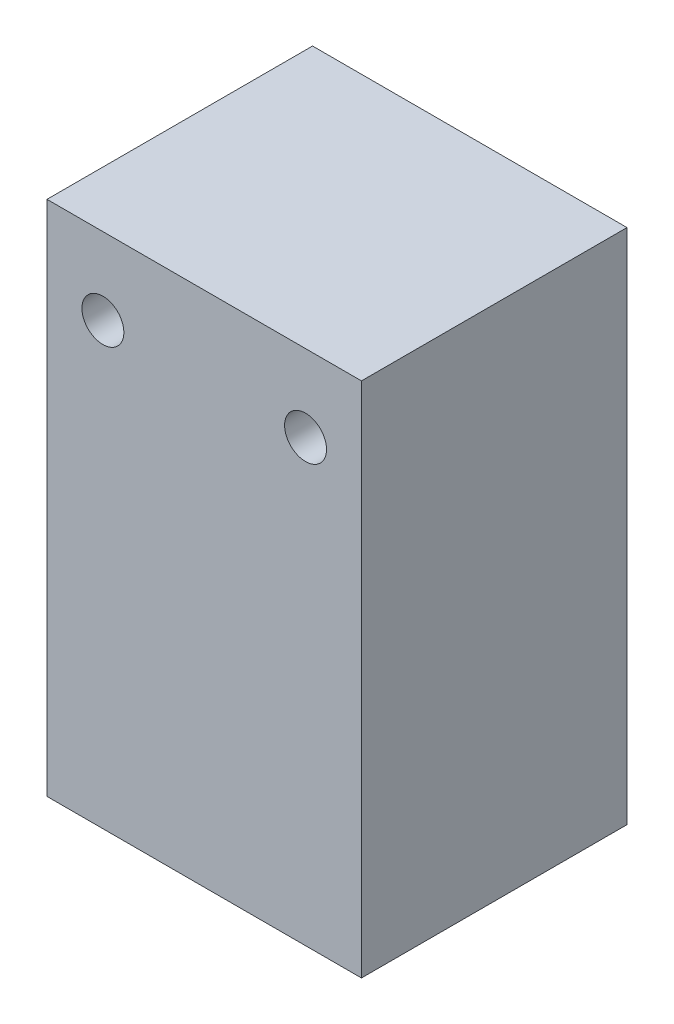
ISO-10303-21;
HEADER;
FILE_DESCRIPTION(('STEP AP214'),'2;1');
FILE_NAME('part.step','',(''),(''),'','','');
FILE_SCHEMA(('AUTOMOTIVE_DESIGN { 1 0 10303 214 1 1 1 1 }'));
ENDSEC;
DATA;
#1=APPLICATION_CONTEXT('core data for automotive mechanical design processes');
#2=APPLICATION_PROTOCOL_DEFINITION('international standard','automotive_design',2000,#1);
#3=PRODUCT_CONTEXT('',#1,'mechanical');
#4=PRODUCT('Part','Part','',(#3));
#5=PRODUCT_RELATED_PRODUCT_CATEGORY('part','',(#4));
#6=PRODUCT_DEFINITION_FORMATION('','',#4);
#7=PRODUCT_DEFINITION_CONTEXT('part definition',#1,'design');
#8=PRODUCT_DEFINITION('design','',#6,#7);
#9=PRODUCT_DEFINITION_SHAPE('','',#8);
#10=(LENGTH_UNIT() NAMED_UNIT(*) SI_UNIT(.MILLI.,.METRE.));
#11=(NAMED_UNIT(*) PLANE_ANGLE_UNIT() SI_UNIT($,.RADIAN.));
#12=(NAMED_UNIT(*) SI_UNIT($,.STERADIAN.) SOLID_ANGLE_UNIT());
#13=UNCERTAINTY_MEASURE_WITH_UNIT(LENGTH_MEASURE(1.E-05),#10,'distance_accuracy_value','');
#14=(GEOMETRIC_REPRESENTATION_CONTEXT(3) GLOBAL_UNCERTAINTY_ASSIGNED_CONTEXT((#13)) GLOBAL_UNIT_ASSIGNED_CONTEXT((#10,
#11,#12)) REPRESENTATION_CONTEXT('',''));
#15=CARTESIAN_POINT('',(0.,0.,0.));
#16=DIRECTION('',(0.,0.,1.));
#17=DIRECTION('',(1.,0.,0.));
#18=AXIS2_PLACEMENT_3D('',#15,#16,#17);
#19=CARTESIAN_POINT('',(0.,0.,19.));
#20=DIRECTION('',(0.,-1.,0.));
#21=DIRECTION('',(1.,0.,0.));
#22=AXIS2_PLACEMENT_3D('',#19,#20,#21);
#23=PLANE('',#22);
#24=DIRECTION('',(-1.,0.,0.));
#25=VECTOR('',#24,1.);
#26=CARTESIAN_POINT('',(0.,0.,0.));
#27=LINE('',#26,#25);
#28=CARTESIAN_POINT('',(0.,0.,0.));
#29=VERTEX_POINT('',#28);
#30=CARTESIAN_POINT('',(-22.5,0.,0.));
#31=VERTEX_POINT('',#30);
#32=EDGE_CURVE('E204',#29,#31,#27,.T.);
#33=ORIENTED_EDGE('',*,*,#32,.F.);
#34=DIRECTION('',(0.,0.,-1.));
#35=VECTOR('',#34,1.);
#36=CARTESIAN_POINT('',(0.,0.,19.));
#37=LINE('',#36,#35);
#38=CARTESIAN_POINT('',(0.,0.,19.));
#39=VERTEX_POINT('',#38);
#40=EDGE_CURVE('E44',#39,#29,#37,.T.);
#41=ORIENTED_EDGE('',*,*,#40,.F.);
#42=DIRECTION('',(-1.,0.,0.));
#43=VECTOR('',#42,1.);
#44=CARTESIAN_POINT('',(0.,0.,19.));
#45=LINE('',#44,#43);
#46=CARTESIAN_POINT('',(-22.5,0.,19.));
#47=VERTEX_POINT('',#46);
#48=EDGE_CURVE('E187',#39,#47,#45,.T.);
#49=ORIENTED_EDGE('',*,*,#48,.T.);
#50=DIRECTION('',(0.,0.,-1.));
#51=VECTOR('',#50,1.);
#52=CARTESIAN_POINT('',(-22.5,0.,19.));
#53=LINE('',#52,#51);
#54=EDGE_CURVE('E11',#47,#31,#53,.T.);
#55=ORIENTED_EDGE('',*,*,#54,.T.);
#56=EDGE_LOOP('',(#33,#41,#49,#55));
#57=FACE_BOUND('',#56,.T.);
#58=DIRECTION('',(1.,0.,0.));
#59=VECTOR('',#58,1.);
#60=CARTESIAN_POINT('',(-13.825,0.,8.15));
#61=LINE('',#60,#59);
#62=CARTESIAN_POINT('',(-13.825,0.,8.15));
#63=VERTEX_POINT('',#62);
#64=CARTESIAN_POINT('',(-8.675,0.,8.15));
#65=VERTEX_POINT('',#64);
#66=EDGE_CURVE('E437',#63,#65,#61,.T.);
#67=ORIENTED_EDGE('',*,*,#66,.F.);
#68=DIRECTION('',(0.,0.,-1.));
#69=VECTOR('',#68,1.);
#70=CARTESIAN_POINT('',(-13.825,0.,10.85));
#71=LINE('',#70,#69);
#72=CARTESIAN_POINT('',(-13.825,0.,10.85));
#73=VERTEX_POINT('',#72);
#74=EDGE_CURVE('E147',#73,#63,#71,.T.);
#75=ORIENTED_EDGE('',*,*,#74,.F.);
#76=DIRECTION('',(-1.,0.,0.));
#77=VECTOR('',#76,1.);
#78=CARTESIAN_POINT('',(-13.825,0.,10.85));
#79=LINE('',#78,#77);
#80=CARTESIAN_POINT('',(-8.675,0.,10.85));
#81=VERTEX_POINT('',#80);
#82=EDGE_CURVE('E143',#81,#73,#79,.T.);
#83=ORIENTED_EDGE('',*,*,#82,.F.);
#84=DIRECTION('',(0.,0.,1.));
#85=VECTOR('',#84,1.);
#86=CARTESIAN_POINT('',(-8.675,0.,10.85));
#87=LINE('',#86,#85);
#88=EDGE_CURVE('E444',#65,#81,#87,.T.);
#89=ORIENTED_EDGE('',*,*,#88,.F.);
#90=EDGE_LOOP('',(#67,#75,#83,#89));
#91=FACE_BOUND('',#90,.T.);
#92=ADVANCED_FACE('F35',(#57,#91),#23,.T.);
#93=CARTESIAN_POINT('',(0.,0.,0.));
#94=DIRECTION('',(0.,0.,1.));
#95=DIRECTION('',(1.,0.,0.));
#96=AXIS2_PLACEMENT_3D('',#93,#94,#95);
#97=PLANE('',#96);
#98=CARTESIAN_POINT('',(-4.,31.5,0.));
#99=DIRECTION('',(0.,0.,1.));
#100=DIRECTION('',(1.,0.,0.));
#101=AXIS2_PLACEMENT_3D('',#98,#99,#100);
#102=CIRCLE('',#101,1.5);
#103=CARTESIAN_POINT('',(-2.5,31.5,0.));
#104=VERTEX_POINT('',#103);
#105=EDGE_CURVE('E188',#104,#104,#102,.T.);
#106=ORIENTED_EDGE('',*,*,#105,.T.);
#107=EDGE_LOOP('',(#106));
#108=FACE_BOUND('',#107,.T.);
#109=CARTESIAN_POINT('',(-18.5,31.5,0.));
#110=DIRECTION('',(0.,0.,1.));
#111=DIRECTION('',(1.,0.,0.));
#112=AXIS2_PLACEMENT_3D('',#109,#110,#111);
#113=CIRCLE('',#112,1.5);
#114=CARTESIAN_POINT('',(-17.,31.5,0.));
#115=VERTEX_POINT('',#114);
#116=EDGE_CURVE('E212',#115,#115,#113,.T.);
#117=ORIENTED_EDGE('',*,*,#116,.T.);
#118=EDGE_LOOP('',(#117));
#119=FACE_BOUND('',#118,.T.);
#120=DIRECTION('',(0.,1.,0.));
#121=VECTOR('',#120,1.);
#122=CARTESIAN_POINT('',(-22.5,0.,0.));
#123=LINE('',#122,#121);
#124=CARTESIAN_POINT('',(-22.5,37.,0.));
#125=VERTEX_POINT('',#124);
#126=EDGE_CURVE('E175',#31,#125,#123,.T.);
#127=ORIENTED_EDGE('',*,*,#126,.T.);
#128=DIRECTION('',(-1.,0.,0.));
#129=VECTOR('',#128,1.);
#130=CARTESIAN_POINT('',(0.,37.,0.));
#131=LINE('',#130,#129);
#132=CARTESIAN_POINT('',(0.,37.,0.));
#133=VERTEX_POINT('',#132);
#134=EDGE_CURVE('E209',#133,#125,#131,.T.);
#135=ORIENTED_EDGE('',*,*,#134,.F.);
#136=DIRECTION('',(0.,1.,0.));
#137=VECTOR('',#136,1.);
#138=CARTESIAN_POINT('',(0.,0.,0.));
#139=LINE('',#138,#137);
#140=EDGE_CURVE('E207',#29,#133,#139,.T.);
#141=ORIENTED_EDGE('',*,*,#140,.F.);
#142=ORIENTED_EDGE('',*,*,#32,.T.);
#143=EDGE_LOOP('',(#127,#135,#141,#142));
#144=FACE_BOUND('',#143,.T.);
#145=CARTESIAN_POINT('',(-11.1,10.55,0.));
#146=DIRECTION('',(0.,0.,1.));
#147=DIRECTION('',(1.,0.,0.));
#148=AXIS2_PLACEMENT_3D('',#145,#146,#147);
#149=CIRCLE('',#148,2.5);
#150=CARTESIAN_POINT('',(-9.41848282791998,12.4,0.));
#151=VERTEX_POINT('',#150);
#152=CARTESIAN_POINT('',(-9.41848282791998,8.7,0.));
#153=VERTEX_POINT('',#152);
#154=EDGE_CURVE('E149',#151,#153,#149,.F.);
#155=ORIENTED_EDGE('',*,*,#154,.F.);
#156=DIRECTION('',(1.,0.,0.));
#157=VECTOR('',#156,1.);
#158=CARTESIAN_POINT('',(0.,12.4,0.));
#159=LINE('',#158,#157);
#160=CARTESIAN_POINT('',(-13.08151717208,12.4,0.));
#161=VERTEX_POINT('',#160);
#162=EDGE_CURVE('E152',#161,#151,#159,.T.);
#163=ORIENTED_EDGE('',*,*,#162,.F.);
#164=CARTESIAN_POINT('',(-11.4,10.55,0.));
#165=DIRECTION('',(0.,0.,1.));
#166=DIRECTION('',(1.,0.,0.));
#167=AXIS2_PLACEMENT_3D('',#164,#165,#166);
#168=CIRCLE('',#167,2.5);
#169=CARTESIAN_POINT('',(-13.08151717208,8.7,0.));
#170=VERTEX_POINT('',#169);
#171=EDGE_CURVE('E169',#170,#161,#168,.F.);
#172=ORIENTED_EDGE('',*,*,#171,.F.);
#173=DIRECTION('',(1.,0.,0.));
#174=VECTOR('',#173,1.);
#175=CARTESIAN_POINT('',(0.,8.7,0.));
#176=LINE('',#175,#174);
#177=EDGE_CURVE('E59',#170,#153,#176,.T.);
#178=ORIENTED_EDGE('',*,*,#177,.T.);
#179=EDGE_LOOP('',(#155,#163,#172,#178));
#180=FACE_BOUND('',#179,.T.);
#181=ADVANCED_FACE('F231',(#108,#119,#144,#180),#97,.F.);
#182=CARTESIAN_POINT('',(-22.5,0.,19.));
#183=DIRECTION('',(-1.,0.,0.));
#184=DIRECTION('',(0.,0.,1.));
#185=AXIS2_PLACEMENT_3D('',#182,#183,#184);
#186=PLANE('',#185);
#187=ORIENTED_EDGE('',*,*,#126,.F.);
#188=ORIENTED_EDGE('',*,*,#54,.F.);
#189=DIRECTION('',(0.,1.,0.));
#190=VECTOR('',#189,1.);
#191=CARTESIAN_POINT('',(-22.5,0.,19.));
#192=LINE('',#191,#190);
#193=CARTESIAN_POINT('',(-22.5,37.,19.));
#194=VERTEX_POINT('',#193);
#195=EDGE_CURVE('E184',#47,#194,#192,.T.);
#196=ORIENTED_EDGE('',*,*,#195,.T.);
#197=DIRECTION('',(0.,0.,-1.));
#198=VECTOR('',#197,1.);
#199=CARTESIAN_POINT('',(-22.5,37.,19.));
#200=LINE('',#199,#198);
#201=EDGE_CURVE('E201',#194,#125,#200,.T.);
#202=ORIENTED_EDGE('',*,*,#201,.T.);
#203=EDGE_LOOP('',(#187,#188,#196,#202));
#204=FACE_BOUND('',#203,.T.);
#205=ADVANCED_FACE('F37',(#204),#186,.T.);
#206=CARTESIAN_POINT('',(0.,0.,19.));
#207=DIRECTION('',(-1.,0.,0.));
#208=DIRECTION('',(0.,0.,1.));
#209=AXIS2_PLACEMENT_3D('',#206,#207,#208);
#210=PLANE('',#209);
#211=ORIENTED_EDGE('',*,*,#140,.T.);
#212=DIRECTION('',(0.,0.,-1.));
#213=VECTOR('',#212,1.);
#214=CARTESIAN_POINT('',(0.,37.,19.));
#215=LINE('',#214,#213);
#216=CARTESIAN_POINT('',(0.,37.,19.));
#217=VERTEX_POINT('',#216);
#218=EDGE_CURVE('E218',#217,#133,#215,.T.);
#219=ORIENTED_EDGE('',*,*,#218,.F.);
#220=DIRECTION('',(0.,1.,0.));
#221=VECTOR('',#220,1.);
#222=CARTESIAN_POINT('',(0.,0.,19.));
#223=LINE('',#222,#221);
#224=EDGE_CURVE('E191',#39,#217,#223,.T.);
#225=ORIENTED_EDGE('',*,*,#224,.F.);
#226=ORIENTED_EDGE('',*,*,#40,.T.);
#227=EDGE_LOOP('',(#211,#219,#225,#226));
#228=FACE_BOUND('',#227,.T.);
#229=ADVANCED_FACE('F224',(#228),#210,.F.);
#230=CARTESIAN_POINT('',(-18.5,31.5,19.));
#231=DIRECTION('',(0.,0.,-1.));
#232=DIRECTION('',(-1.,0.,0.));
#233=AXIS2_PLACEMENT_3D('',#230,#231,#232);
#234=CYLINDRICAL_SURFACE('',#233,1.5);
#235=CARTESIAN_POINT('',(-18.5,31.5,19.));
#236=DIRECTION('',(0.,0.,1.));
#237=DIRECTION('',(1.,0.,0.));
#238=AXIS2_PLACEMENT_3D('',#235,#236,#237);
#239=CIRCLE('',#238,1.5);
#240=CARTESIAN_POINT('',(-17.,31.5,19.));
#241=VERTEX_POINT('',#240);
#242=EDGE_CURVE('E195',#241,#241,#239,.T.);
#243=ORIENTED_EDGE('',*,*,#242,.T.);
#244=EDGE_LOOP('',(#243));
#245=FACE_BOUND('',#244,.T.);
#246=ORIENTED_EDGE('',*,*,#116,.F.);
#247=EDGE_LOOP('',(#246));
#248=FACE_BOUND('',#247,.T.);
#249=ADVANCED_FACE('F261',(#245,#248),#234,.F.);
#250=CARTESIAN_POINT('',(0.,37.,19.));
#251=DIRECTION('',(0.,-1.,0.));
#252=DIRECTION('',(0.,0.,-1.));
#253=AXIS2_PLACEMENT_3D('',#250,#251,#252);
#254=PLANE('',#253);
#255=ORIENTED_EDGE('',*,*,#134,.T.);
#256=ORIENTED_EDGE('',*,*,#201,.F.);
#257=DIRECTION('',(-1.,0.,0.));
#258=VECTOR('',#257,1.);
#259=CARTESIAN_POINT('',(0.,37.,19.));
#260=LINE('',#259,#258);
#261=EDGE_CURVE('E193',#217,#194,#260,.T.);
#262=ORIENTED_EDGE('',*,*,#261,.F.);
#263=ORIENTED_EDGE('',*,*,#218,.T.);
#264=EDGE_LOOP('',(#255,#256,#262,#263));
#265=FACE_BOUND('',#264,.T.);
#266=ADVANCED_FACE('F239',(#265),#254,.F.);
#267=CARTESIAN_POINT('',(-4.,31.5,19.));
#268=DIRECTION('',(0.,0.,-1.));
#269=DIRECTION('',(-1.,0.,0.));
#270=AXIS2_PLACEMENT_3D('',#267,#268,#269);
#271=CYLINDRICAL_SURFACE('',#270,1.5);
#272=CARTESIAN_POINT('',(-4.,31.5,19.));
#273=DIRECTION('',(0.,0.,1.));
#274=DIRECTION('',(1.,0.,0.));
#275=AXIS2_PLACEMENT_3D('',#272,#273,#274);
#276=CIRCLE('',#275,1.5);
#277=CARTESIAN_POINT('',(-2.5,31.5,19.));
#278=VERTEX_POINT('',#277);
#279=EDGE_CURVE('E198',#278,#278,#276,.T.);
#280=ORIENTED_EDGE('',*,*,#279,.T.);
#281=EDGE_LOOP('',(#280));
#282=FACE_BOUND('',#281,.T.);
#283=ORIENTED_EDGE('',*,*,#105,.F.);
#284=EDGE_LOOP('',(#283));
#285=FACE_BOUND('',#284,.T.);
#286=ADVANCED_FACE('F245',(#282,#285),#271,.F.);
#287=CARTESIAN_POINT('',(0.,0.,19.));
#288=DIRECTION('',(0.,0.,1.));
#289=DIRECTION('',(1.,0.,0.));
#290=AXIS2_PLACEMENT_3D('',#287,#288,#289);
#291=PLANE('',#290);
#292=ORIENTED_EDGE('',*,*,#195,.F.);
#293=ORIENTED_EDGE('',*,*,#48,.F.);
#294=ORIENTED_EDGE('',*,*,#224,.T.);
#295=ORIENTED_EDGE('',*,*,#261,.T.);
#296=EDGE_LOOP('',(#292,#293,#294,#295));
#297=FACE_BOUND('',#296,.T.);
#298=ORIENTED_EDGE('',*,*,#242,.F.);
#299=EDGE_LOOP('',(#298));
#300=FACE_BOUND('',#299,.T.);
#301=ORIENTED_EDGE('',*,*,#279,.F.);
#302=EDGE_LOOP('',(#301));
#303=FACE_BOUND('',#302,.T.);
#304=ADVANCED_FACE('F241',(#297,#300,#303),#291,.T.);
#305=CARTESIAN_POINT('',(-11.1,10.55,-8.));
#306=DIRECTION('',(0.,0.,1.));
#307=DIRECTION('',(1.,0.,0.));
#308=AXIS2_PLACEMENT_3D('',#305,#306,#307);
#309=CYLINDRICAL_SURFACE('',#308,2.5);
#310=ORIENTED_EDGE('',*,*,#154,.T.);
#311=DIRECTION('',(0.,0.,1.));
#312=VECTOR('',#311,1.);
#313=CARTESIAN_POINT('',(-9.41848282791998,8.7,-8.));
#314=LINE('',#313,#312);
#315=CARTESIAN_POINT('',(-9.41848282791998,8.7,-8.));
#316=VERTEX_POINT('',#315);
#317=EDGE_CURVE('E173',#316,#153,#314,.T.);
#318=ORIENTED_EDGE('',*,*,#317,.F.);
#319=CARTESIAN_POINT('',(-11.1,10.55,-8.));
#320=DIRECTION('',(0.,0.,1.));
#321=DIRECTION('',(1.,0.,0.));
#322=AXIS2_PLACEMENT_3D('',#319,#320,#321);
#323=CIRCLE('',#322,2.5);
#324=CARTESIAN_POINT('',(-9.41848282791998,12.4,-8.));
#325=VERTEX_POINT('',#324);
#326=EDGE_CURVE('E157',#325,#316,#323,.F.);
#327=ORIENTED_EDGE('',*,*,#326,.F.);
#328=DIRECTION('',(0.,0.,1.));
#329=VECTOR('',#328,1.);
#330=CARTESIAN_POINT('',(-9.41848282791998,12.4,-8.));
#331=LINE('',#330,#329);
#332=EDGE_CURVE('E165',#325,#151,#331,.T.);
#333=ORIENTED_EDGE('',*,*,#332,.T.);
#334=EDGE_LOOP('',(#310,#318,#327,#333));
#335=FACE_BOUND('',#334,.T.);
#336=ADVANCED_FACE('F244',(#335),#309,.T.);
#337=CARTESIAN_POINT('',(0.,8.7,-8.));
#338=DIRECTION('',(0.,-1.,0.));
#339=DIRECTION('',(0.,0.,-1.));
#340=AXIS2_PLACEMENT_3D('',#337,#338,#339);
#341=PLANE('',#340);
#342=ORIENTED_EDGE('',*,*,#177,.F.);
#343=DIRECTION('',(0.,0.,1.));
#344=VECTOR('',#343,1.);
#345=CARTESIAN_POINT('',(-13.08151717208,8.7,-8.));
#346=LINE('',#345,#344);
#347=CARTESIAN_POINT('',(-13.08151717208,8.7,-8.));
#348=VERTEX_POINT('',#347);
#349=EDGE_CURVE('E176',#348,#170,#346,.T.);
#350=ORIENTED_EDGE('',*,*,#349,.F.);
#351=DIRECTION('',(1.,0.,0.));
#352=VECTOR('',#351,1.);
#353=CARTESIAN_POINT('',(0.,8.7,-8.));
#354=LINE('',#353,#352);
#355=EDGE_CURVE('E163',#348,#316,#354,.T.);
#356=ORIENTED_EDGE('',*,*,#355,.T.);
#357=ORIENTED_EDGE('',*,*,#317,.T.);
#358=EDGE_LOOP('',(#342,#350,#356,#357));
#359=FACE_BOUND('',#358,.T.);
#360=ADVANCED_FACE('F344',(#359),#341,.T.);
#361=CARTESIAN_POINT('',(-11.4,10.55,-8.));
#362=DIRECTION('',(0.,0.,1.));
#363=DIRECTION('',(1.,0.,0.));
#364=AXIS2_PLACEMENT_3D('',#361,#362,#363);
#365=CYLINDRICAL_SURFACE('',#364,2.5);
#366=ORIENTED_EDGE('',*,*,#171,.T.);
#367=DIRECTION('',(0.,0.,1.));
#368=VECTOR('',#367,1.);
#369=CARTESIAN_POINT('',(-13.08151717208,12.4,-8.));
#370=LINE('',#369,#368);
#371=CARTESIAN_POINT('',(-13.08151717208,12.4,-8.));
#372=VERTEX_POINT('',#371);
#373=EDGE_CURVE('E179',#372,#161,#370,.T.);
#374=ORIENTED_EDGE('',*,*,#373,.F.);
#375=CARTESIAN_POINT('',(-11.4,10.55,-8.));
#376=DIRECTION('',(0.,0.,1.));
#377=DIRECTION('',(1.,0.,0.));
#378=AXIS2_PLACEMENT_3D('',#375,#376,#377);
#379=CIRCLE('',#378,2.5);
#380=EDGE_CURVE('E161',#348,#372,#379,.F.);
#381=ORIENTED_EDGE('',*,*,#380,.F.);
#382=ORIENTED_EDGE('',*,*,#349,.T.);
#383=EDGE_LOOP('',(#366,#374,#381,#382));
#384=FACE_BOUND('',#383,.T.);
#385=ADVANCED_FACE('F347',(#384),#365,.T.);
#386=CARTESIAN_POINT('',(0.,12.4,-8.));
#387=DIRECTION('',(0.,-1.,0.));
#388=DIRECTION('',(0.,0.,-1.));
#389=AXIS2_PLACEMENT_3D('',#386,#387,#388);
#390=PLANE('',#389);
#391=ORIENTED_EDGE('',*,*,#162,.T.);
#392=ORIENTED_EDGE('',*,*,#332,.F.);
#393=DIRECTION('',(1.,0.,0.));
#394=VECTOR('',#393,1.);
#395=CARTESIAN_POINT('',(0.,12.4,-8.));
#396=LINE('',#395,#394);
#397=EDGE_CURVE('E159',#372,#325,#396,.T.);
#398=ORIENTED_EDGE('',*,*,#397,.F.);
#399=ORIENTED_EDGE('',*,*,#373,.T.);
#400=EDGE_LOOP('',(#391,#392,#398,#399));
#401=FACE_BOUND('',#400,.T.);
#402=ADVANCED_FACE('F342',(#401),#390,.F.);
#403=CARTESIAN_POINT('',(0.,0.,-8.));
#404=DIRECTION('',(0.,0.,1.));
#405=DIRECTION('',(1.,0.,0.));
#406=AXIS2_PLACEMENT_3D('',#403,#404,#405);
#407=PLANE('',#406);
#408=ORIENTED_EDGE('',*,*,#326,.T.);
#409=ORIENTED_EDGE('',*,*,#355,.F.);
#410=ORIENTED_EDGE('',*,*,#380,.T.);
#411=ORIENTED_EDGE('',*,*,#397,.T.);
#412=EDGE_LOOP('',(#408,#409,#410,#411));
#413=FACE_BOUND('',#412,.T.);
#414=ADVANCED_FACE('F281',(#413),#407,.F.);
#415=CARTESIAN_POINT('',(-13.825,-4.8,10.85));
#416=DIRECTION('',(1.,0.,0.));
#417=DIRECTION('',(0.,1.,0.));
#418=AXIS2_PLACEMENT_3D('',#415,#416,#417);
#419=PLANE('',#418);
#420=ORIENTED_EDGE('',*,*,#74,.T.);
#421=DIRECTION('',(0.,1.,0.));
#422=VECTOR('',#421,1.);
#423=CARTESIAN_POINT('',(-13.825,-4.8,8.15));
#424=LINE('',#423,#422);
#425=CARTESIAN_POINT('',(-13.825,-4.8,8.15));
#426=VERTEX_POINT('',#425);
#427=EDGE_CURVE('E128',#426,#63,#424,.T.);
#428=ORIENTED_EDGE('',*,*,#427,.F.);
#429=DIRECTION('',(0.,0.,-1.));
#430=VECTOR('',#429,1.);
#431=CARTESIAN_POINT('',(-13.825,-4.8,10.85));
#432=LINE('',#431,#430);
#433=CARTESIAN_POINT('',(-13.825,-4.8,10.85));
#434=VERTEX_POINT('',#433);
#435=EDGE_CURVE('E135',#434,#426,#432,.T.);
#436=ORIENTED_EDGE('',*,*,#435,.F.);
#437=DIRECTION('',(0.,1.,0.));
#438=VECTOR('',#437,1.);
#439=CARTESIAN_POINT('',(-13.825,-4.8,10.85));
#440=LINE('',#439,#438);
#441=EDGE_CURVE('E441',#434,#73,#440,.T.);
#442=ORIENTED_EDGE('',*,*,#441,.T.);
#443=EDGE_LOOP('',(#420,#428,#436,#442));
#444=FACE_BOUND('',#443,.T.);
#445=ADVANCED_FACE('F145',(#444),#419,.F.);
#446=CARTESIAN_POINT('',(-13.825,-4.8,8.15));
#447=DIRECTION('',(0.,0.,1.));
#448=DIRECTION('',(1.,0.,0.));
#449=AXIS2_PLACEMENT_3D('',#446,#447,#448);
#450=PLANE('',#449);
#451=CARTESIAN_POINT('',(-11.25,-2.4,8.15));
#452=DIRECTION('',(0.,0.,1.));
#453=DIRECTION('',(1.,0.,0.));
#454=AXIS2_PLACEMENT_3D('',#451,#452,#453);
#455=CIRCLE('',#454,1.5);
#456=CARTESIAN_POINT('',(-9.75,-2.4,8.15));
#457=VERTEX_POINT('',#456);
#458=EDGE_CURVE('E435',#457,#457,#455,.T.);
#459=ORIENTED_EDGE('',*,*,#458,.T.);
#460=EDGE_LOOP('',(#459));
#461=FACE_BOUND('',#460,.T.);
#462=ORIENTED_EDGE('',*,*,#66,.T.);
#463=DIRECTION('',(0.,1.,0.));
#464=VECTOR('',#463,1.);
#465=CARTESIAN_POINT('',(-8.675,-4.8,8.15));
#466=LINE('',#465,#464);
#467=CARTESIAN_POINT('',(-8.675,-4.8,8.15));
#468=VERTEX_POINT('',#467);
#469=EDGE_CURVE('E131',#468,#65,#466,.T.);
#470=ORIENTED_EDGE('',*,*,#469,.F.);
#471=DIRECTION('',(1.,0.,0.));
#472=VECTOR('',#471,1.);
#473=CARTESIAN_POINT('',(-13.825,-4.8,8.15));
#474=LINE('',#473,#472);
#475=EDGE_CURVE('E124',#426,#468,#474,.T.);
#476=ORIENTED_EDGE('',*,*,#475,.F.);
#477=ORIENTED_EDGE('',*,*,#427,.T.);
#478=EDGE_LOOP('',(#462,#470,#476,#477));
#479=FACE_BOUND('',#478,.T.);
#480=ADVANCED_FACE('F126',(#461,#479),#450,.F.);
#481=CARTESIAN_POINT('',(-8.675,-4.8,10.85));
#482=DIRECTION('',(-1.,0.,0.));
#483=DIRECTION('',(0.,-1.,0.));
#484=AXIS2_PLACEMENT_3D('',#481,#482,#483);
#485=PLANE('',#484);
#486=ORIENTED_EDGE('',*,*,#88,.T.);
#487=DIRECTION('',(0.,1.,0.));
#488=VECTOR('',#487,1.);
#489=CARTESIAN_POINT('',(-8.675,-4.8,10.85));
#490=LINE('',#489,#488);
#491=CARTESIAN_POINT('',(-8.675,-4.8,10.85));
#492=VERTEX_POINT('',#491);
#493=EDGE_CURVE('E51',#492,#81,#490,.T.);
#494=ORIENTED_EDGE('',*,*,#493,.F.);
#495=DIRECTION('',(0.,0.,1.));
#496=VECTOR('',#495,1.);
#497=CARTESIAN_POINT('',(-8.675,-4.8,10.85));
#498=LINE('',#497,#496);
#499=EDGE_CURVE('E134',#468,#492,#498,.T.);
#500=ORIENTED_EDGE('',*,*,#499,.F.);
#501=ORIENTED_EDGE('',*,*,#469,.T.);
#502=EDGE_LOOP('',(#486,#494,#500,#501));
#503=FACE_BOUND('',#502,.T.);
#504=ADVANCED_FACE('F294',(#503),#485,.F.);
#505=CARTESIAN_POINT('',(-13.825,-4.8,10.85));
#506=DIRECTION('',(0.,0.,-1.));
#507=DIRECTION('',(-1.,0.,0.));
#508=AXIS2_PLACEMENT_3D('',#505,#506,#507);
#509=PLANE('',#508);
#510=CARTESIAN_POINT('',(-11.25,-2.4,10.85));
#511=DIRECTION('',(0.,0.,-1.));
#512=DIRECTION('',(-1.,0.,0.));
#513=AXIS2_PLACEMENT_3D('',#510,#511,#512);
#514=CIRCLE('',#513,1.5);
#515=CARTESIAN_POINT('',(-12.75,-2.4,10.85));
#516=VERTEX_POINT('',#515);
#517=EDGE_CURVE('E39',#516,#516,#514,.T.);
#518=ORIENTED_EDGE('',*,*,#517,.T.);
#519=EDGE_LOOP('',(#518));
#520=FACE_BOUND('',#519,.T.);
#521=ORIENTED_EDGE('',*,*,#82,.T.);
#522=ORIENTED_EDGE('',*,*,#441,.F.);
#523=DIRECTION('',(-1.,0.,0.));
#524=VECTOR('',#523,1.);
#525=CARTESIAN_POINT('',(-13.825,-4.8,10.85));
#526=LINE('',#525,#524);
#527=EDGE_CURVE('E139',#492,#434,#526,.T.);
#528=ORIENTED_EDGE('',*,*,#527,.F.);
#529=ORIENTED_EDGE('',*,*,#493,.T.);
#530=EDGE_LOOP('',(#521,#522,#528,#529));
#531=FACE_BOUND('',#530,.T.);
#532=ADVANCED_FACE('F299',(#520,#531),#509,.F.);
#533=CARTESIAN_POINT('',(0.,-4.8,0.));
#534=DIRECTION('',(0.,-1.,0.));
#535=DIRECTION('',(1.,0.,0.));
#536=AXIS2_PLACEMENT_3D('',#533,#534,#535);
#537=PLANE('',#536);
#538=ORIENTED_EDGE('',*,*,#435,.T.);
#539=ORIENTED_EDGE('',*,*,#475,.T.);
#540=ORIENTED_EDGE('',*,*,#499,.T.);
#541=ORIENTED_EDGE('',*,*,#527,.T.);
#542=EDGE_LOOP('',(#538,#539,#540,#541));
#543=FACE_BOUND('',#542,.T.);
#544=ADVANCED_FACE('F138',(#543),#537,.T.);
#545=CARTESIAN_POINT('',(-11.25,-2.4,19.));
#546=DIRECTION('',(0.,0.,-1.));
#547=DIRECTION('',(-1.,0.,0.));
#548=AXIS2_PLACEMENT_3D('',#545,#546,#547);
#549=CYLINDRICAL_SURFACE('',#548,1.5);
#550=ORIENTED_EDGE('',*,*,#517,.F.);
#551=EDGE_LOOP('',(#550));
#552=FACE_BOUND('',#551,.T.);
#553=ORIENTED_EDGE('',*,*,#458,.F.);
#554=EDGE_LOOP('',(#553));
#555=FACE_BOUND('',#554,.T.);
#556=ADVANCED_FACE('F311',(#552,#555),#549,.F.);
#557=CLOSED_SHELL('',(#92,#181,#205,#229,#249,#266,#286,#304,#336,#360,#385,#402,#414,#445,#480,
#504,#532,#544,#556));
#558=MANIFOLD_SOLID_BREP('B2',#557);
#559=ADVANCED_BREP_SHAPE_REPRESENTATION('',(#18,#558),#14);
#560=SHAPE_DEFINITION_REPRESENTATION(#9,#559);
ENDSEC;
END-ISO-10303-21;
